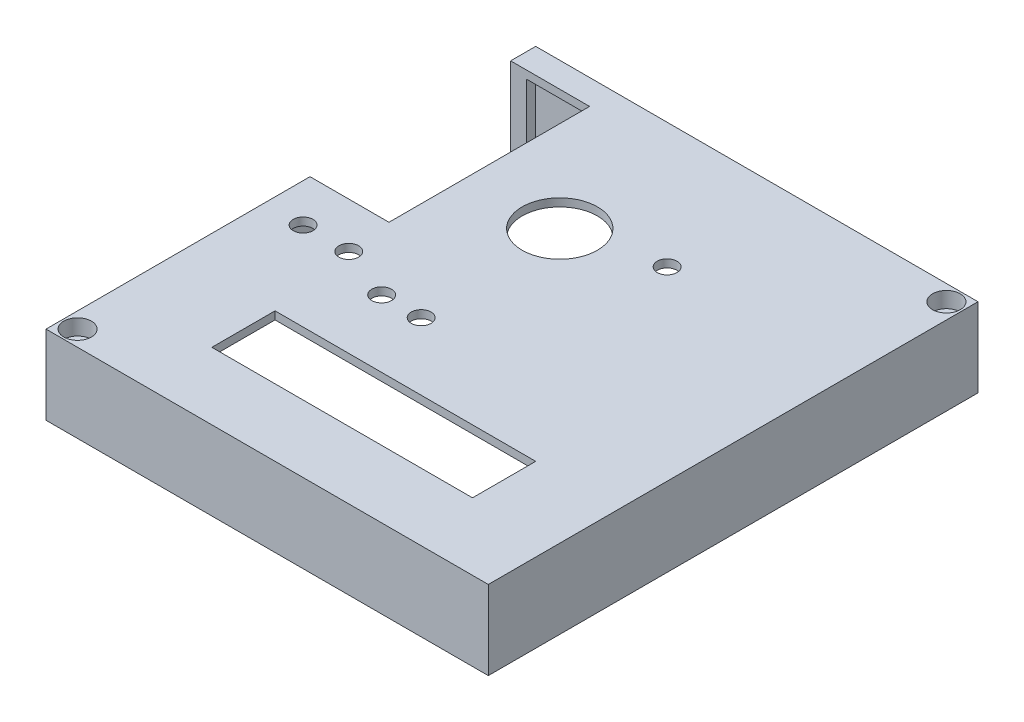
ISO-10303-21;
HEADER;
FILE_DESCRIPTION(('STEP AP214'),'2;1');
FILE_NAME('part.step','',(''),(''),'','','');
FILE_SCHEMA(('AUTOMOTIVE_DESIGN { 1 0 10303 214 1 1 1 1 }'));
ENDSEC;
DATA;
#1=APPLICATION_CONTEXT('core data for automotive mechanical design processes');
#2=APPLICATION_PROTOCOL_DEFINITION('international standard','automotive_design',2000,#1);
#3=PRODUCT_CONTEXT('',#1,'mechanical');
#4=PRODUCT('Part','Part','',(#3));
#5=PRODUCT_RELATED_PRODUCT_CATEGORY('part','',(#4));
#6=PRODUCT_DEFINITION_FORMATION('','',#4);
#7=PRODUCT_DEFINITION_CONTEXT('part definition',#1,'design');
#8=PRODUCT_DEFINITION('design','',#6,#7);
#9=PRODUCT_DEFINITION_SHAPE('','',#8);
#10=(LENGTH_UNIT() NAMED_UNIT(*) SI_UNIT(.MILLI.,.METRE.));
#11=(NAMED_UNIT(*) PLANE_ANGLE_UNIT() SI_UNIT($,.RADIAN.));
#12=(NAMED_UNIT(*) SI_UNIT($,.STERADIAN.) SOLID_ANGLE_UNIT());
#13=UNCERTAINTY_MEASURE_WITH_UNIT(LENGTH_MEASURE(1.E-05),#10,'distance_accuracy_value','');
#14=(GEOMETRIC_REPRESENTATION_CONTEXT(3) GLOBAL_UNCERTAINTY_ASSIGNED_CONTEXT((#13)) GLOBAL_UNIT_ASSIGNED_CONTEXT((#10,
#11,#12)) REPRESENTATION_CONTEXT('',''));
#15=CARTESIAN_POINT('',(0.,0.,0.));
#16=DIRECTION('',(0.,0.,1.));
#17=DIRECTION('',(1.,0.,0.));
#18=AXIS2_PLACEMENT_3D('',#15,#16,#17);
#19=CARTESIAN_POINT('',(-56.,2.,62.));
#20=DIRECTION('',(1.,0.,0.));
#21=DIRECTION('',(0.,0.,-1.));
#22=AXIS2_PLACEMENT_3D('',#19,#20,#21);
#23=PLANE('',#22);
#24=DIRECTION('',(0.,0.,-1.));
#25=VECTOR('',#24,1.);
#26=CARTESIAN_POINT('',(-56.,-18.,62.));
#27=LINE('',#26,#25);
#28=CARTESIAN_POINT('',(-56.,-18.,-55.65));
#29=VERTEX_POINT('',#28);
#30=CARTESIAN_POINT('',(-56.,-18.,-62.));
#31=VERTEX_POINT('',#30);
#32=EDGE_CURVE('E375',#29,#31,#27,.T.);
#33=ORIENTED_EDGE('',*,*,#32,.F.);
#34=DIRECTION('',(0.,-1.,0.));
#35=VECTOR('',#34,1.);
#36=CARTESIAN_POINT('',(-56.,2.,-55.65));
#37=LINE('',#36,#35);
#38=CARTESIAN_POINT('',(-56.,2.,-55.65));
#39=VERTEX_POINT('',#38);
#40=EDGE_CURVE('E210',#39,#29,#37,.T.);
#41=ORIENTED_EDGE('',*,*,#40,.F.);
#42=DIRECTION('',(0.,0.,1.));
#43=VECTOR('',#42,1.);
#44=CARTESIAN_POINT('',(-56.,2.,62.));
#45=LINE('',#44,#43);
#46=CARTESIAN_POINT('',(-56.,2.,-62.));
#47=VERTEX_POINT('',#46);
#48=EDGE_CURVE('E385',#47,#39,#45,.T.);
#49=ORIENTED_EDGE('',*,*,#48,.F.);
#50=DIRECTION('',(0.,-1.,0.));
#51=VECTOR('',#50,1.);
#52=CARTESIAN_POINT('',(-56.,2.,-62.));
#53=LINE('',#52,#51);
#54=EDGE_CURVE('E393',#47,#31,#53,.T.);
#55=ORIENTED_EDGE('',*,*,#54,.T.);
#56=EDGE_LOOP('',(#33,#41,#49,#55));
#57=FACE_BOUND('',#56,.T.);
#58=ADVANCED_FACE('F33',(#57),#23,.F.);
#59=CARTESIAN_POINT('',(-52.,-18.,54.));
#60=DIRECTION('',(1.,0.,0.));
#61=DIRECTION('',(0.,0.,-1.));
#62=AXIS2_PLACEMENT_3D('',#59,#60,#61);
#63=PLANE('',#62);
#64=DIRECTION('',(0.,1.,0.));
#65=VECTOR('',#64,1.);
#66=CARTESIAN_POINT('',(-52.,-18.,-55.65));
#67=LINE('',#66,#65);
#68=CARTESIAN_POINT('',(-52.,-18.,-55.65));
#69=VERTEX_POINT('',#68);
#70=CARTESIAN_POINT('',(-52.,0.,-55.65));
#71=VERTEX_POINT('',#70);
#72=EDGE_CURVE('E217',#69,#71,#67,.T.);
#73=ORIENTED_EDGE('',*,*,#72,.F.);
#74=DIRECTION('',(0.,0.,-1.));
#75=VECTOR('',#74,1.);
#76=CARTESIAN_POINT('',(-52.,-18.,54.));
#77=LINE('',#76,#75);
#78=CARTESIAN_POINT('',(-52.,-18.,-58.));
#79=VERTEX_POINT('',#78);
#80=EDGE_CURVE('E313',#69,#79,#77,.T.);
#81=ORIENTED_EDGE('',*,*,#80,.T.);
#82=DIRECTION('',(0.,1.,0.));
#83=VECTOR('',#82,1.);
#84=CARTESIAN_POINT('',(-52.,-18.,-58.));
#85=LINE('',#84,#83);
#86=CARTESIAN_POINT('',(-52.,0.,-58.));
#87=VERTEX_POINT('',#86);
#88=EDGE_CURVE('E354',#79,#87,#85,.T.);
#89=ORIENTED_EDGE('',*,*,#88,.T.);
#90=DIRECTION('',(0.,0.,-1.));
#91=VECTOR('',#90,1.);
#92=CARTESIAN_POINT('',(-52.,0.,54.));
#93=LINE('',#92,#91);
#94=EDGE_CURVE('E332',#71,#87,#93,.T.);
#95=ORIENTED_EDGE('',*,*,#94,.F.);
#96=EDGE_LOOP('',(#73,#81,#89,#95));
#97=FACE_BOUND('',#96,.T.);
#98=ADVANCED_FACE('F452',(#97),#63,.T.);
#99=CARTESIAN_POINT('',(-52.,-18.,58.));
#100=DIRECTION('',(0.,1.,0.));
#101=DIRECTION('',(0.,0.,1.));
#102=AXIS2_PLACEMENT_3D('',#99,#100,#101);
#103=CYLINDRICAL_SURFACE('',#102,2.);
#104=CARTESIAN_POINT('',(-52.,-18.,58.));
#105=DIRECTION('',(0.,1.,0.));
#106=DIRECTION('',(0.,0.,1.));
#107=AXIS2_PLACEMENT_3D('',#104,#105,#106);
#108=CIRCLE('',#107,2.);
#109=CARTESIAN_POINT('',(-52.,-18.,60.));
#110=VERTEX_POINT('',#109);
#111=EDGE_CURVE('E236',#110,#110,#108,.T.);
#112=ORIENTED_EDGE('',*,*,#111,.F.);
#113=EDGE_LOOP('',(#112));
#114=FACE_BOUND('',#113,.T.);
#115=CARTESIAN_POINT('',(-52.,-2.,58.));
#116=DIRECTION('',(0.,1.,0.));
#117=DIRECTION('',(0.,0.,1.));
#118=AXIS2_PLACEMENT_3D('',#115,#116,#117);
#119=CIRCLE('',#118,2.);
#120=CARTESIAN_POINT('',(-52.,-2.,60.));
#121=VERTEX_POINT('',#120);
#122=EDGE_CURVE('E239',#121,#121,#119,.F.);
#123=ORIENTED_EDGE('',*,*,#122,.F.);
#124=EDGE_LOOP('',(#123));
#125=FACE_BOUND('',#124,.T.);
#126=ADVANCED_FACE('F491',(#114,#125),#103,.F.);
#127=CARTESIAN_POINT('',(52.,-18.,-58.));
#128=DIRECTION('',(0.,1.,0.));
#129=DIRECTION('',(0.,0.,1.));
#130=AXIS2_PLACEMENT_3D('',#127,#128,#129);
#131=CYLINDRICAL_SURFACE('',#130,2.);
#132=CARTESIAN_POINT('',(52.,-18.,-58.));
#133=DIRECTION('',(0.,1.,0.));
#134=DIRECTION('',(0.,0.,1.));
#135=AXIS2_PLACEMENT_3D('',#132,#133,#134);
#136=CIRCLE('',#135,2.);
#137=CARTESIAN_POINT('',(52.,-18.,-56.));
#138=VERTEX_POINT('',#137);
#139=EDGE_CURVE('E232',#138,#138,#136,.T.);
#140=ORIENTED_EDGE('',*,*,#139,.F.);
#141=EDGE_LOOP('',(#140));
#142=FACE_BOUND('',#141,.T.);
#143=CARTESIAN_POINT('',(52.,-2.,-58.));
#144=DIRECTION('',(0.,1.,0.));
#145=DIRECTION('',(0.,0.,1.));
#146=AXIS2_PLACEMENT_3D('',#143,#144,#145);
#147=CIRCLE('',#146,2.);
#148=CARTESIAN_POINT('',(52.,-2.,-56.));
#149=VERTEX_POINT('',#148);
#150=EDGE_CURVE('E223',#149,#149,#147,.F.);
#151=ORIENTED_EDGE('',*,*,#150,.F.);
#152=EDGE_LOOP('',(#151));
#153=FACE_BOUND('',#152,.T.);
#154=ADVANCED_FACE('F502',(#142,#153),#131,.F.);
#155=CARTESIAN_POINT('',(56.,2.,62.));
#156=DIRECTION('',(-1.,0.,0.));
#157=DIRECTION('',(0.,0.,1.));
#158=AXIS2_PLACEMENT_3D('',#155,#156,#157);
#159=PLANE('',#158);
#160=DIRECTION('',(0.,-1.,0.));
#161=VECTOR('',#160,1.);
#162=CARTESIAN_POINT('',(56.,2.,62.));
#163=LINE('',#162,#161);
#164=CARTESIAN_POINT('',(56.,2.,62.));
#165=VERTEX_POINT('',#164);
#166=CARTESIAN_POINT('',(56.,-18.,62.));
#167=VERTEX_POINT('',#166);
#168=EDGE_CURVE('E389',#165,#167,#163,.T.);
#169=ORIENTED_EDGE('',*,*,#168,.T.);
#170=DIRECTION('',(0.,0.,1.));
#171=VECTOR('',#170,1.);
#172=CARTESIAN_POINT('',(56.,-18.,-62.));
#173=LINE('',#172,#171);
#174=CARTESIAN_POINT('',(56.,-18.,-62.));
#175=VERTEX_POINT('',#174);
#176=EDGE_CURVE('E369',#175,#167,#173,.T.);
#177=ORIENTED_EDGE('',*,*,#176,.F.);
#178=DIRECTION('',(0.,-1.,0.));
#179=VECTOR('',#178,1.);
#180=CARTESIAN_POINT('',(56.,2.,-62.));
#181=LINE('',#180,#179);
#182=CARTESIAN_POINT('',(56.,2.,-62.));
#183=VERTEX_POINT('',#182);
#184=EDGE_CURVE('E396',#183,#175,#181,.T.);
#185=ORIENTED_EDGE('',*,*,#184,.F.);
#186=DIRECTION('',(0.,0.,-1.));
#187=VECTOR('',#186,1.);
#188=CARTESIAN_POINT('',(56.,2.,62.));
#189=LINE('',#188,#187);
#190=EDGE_CURVE('E379',#165,#183,#189,.T.);
#191=ORIENTED_EDGE('',*,*,#190,.F.);
#192=EDGE_LOOP('',(#169,#177,#185,#191));
#193=FACE_BOUND('',#192,.T.);
#194=ADVANCED_FACE('F35',(#193),#159,.F.);
#195=CARTESIAN_POINT('',(-56.,2.,-62.));
#196=DIRECTION('',(0.,0.,1.));
#197=DIRECTION('',(1.,0.,0.));
#198=AXIS2_PLACEMENT_3D('',#195,#196,#197);
#199=PLANE('',#198);
#200=ORIENTED_EDGE('',*,*,#184,.T.);
#201=DIRECTION('',(1.,0.,0.));
#202=VECTOR('',#201,1.);
#203=CARTESIAN_POINT('',(-56.,-18.,-62.));
#204=LINE('',#203,#202);
#205=EDGE_CURVE('E366',#31,#175,#204,.T.);
#206=ORIENTED_EDGE('',*,*,#205,.F.);
#207=ORIENTED_EDGE('',*,*,#54,.F.);
#208=DIRECTION('',(-1.,0.,0.));
#209=VECTOR('',#208,1.);
#210=CARTESIAN_POINT('',(-56.,2.,-62.));
#211=LINE('',#210,#209);
#212=EDGE_CURVE('E382',#183,#47,#211,.T.);
#213=ORIENTED_EDGE('',*,*,#212,.F.);
#214=EDGE_LOOP('',(#200,#206,#207,#213));
#215=FACE_BOUND('',#214,.T.);
#216=ADVANCED_FACE('F438',(#215),#199,.F.);
#217=CARTESIAN_POINT('',(-56.,2.,-4.85));
#218=VERTEX_POINT('',#217);
#219=CARTESIAN_POINT('',(-56.,2.,62.));
#220=VERTEX_POINT('',#219);
#221=EDGE_CURVE('E384',#218,#220,#45,.T.);
#222=ORIENTED_EDGE('',*,*,#221,.F.);
#223=DIRECTION('',(0.,1.,0.));
#224=VECTOR('',#223,1.);
#225=CARTESIAN_POINT('',(-56.,2.,-4.85));
#226=LINE('',#225,#224);
#227=CARTESIAN_POINT('',(-56.,-18.,-4.85));
#228=VERTEX_POINT('',#227);
#229=EDGE_CURVE('E195',#228,#218,#226,.T.);
#230=ORIENTED_EDGE('',*,*,#229,.F.);
#231=CARTESIAN_POINT('',(-56.,-18.,62.));
#232=VERTEX_POINT('',#231);
#233=EDGE_CURVE('E376',#232,#228,#27,.T.);
#234=ORIENTED_EDGE('',*,*,#233,.F.);
#235=DIRECTION('',(0.,-1.,0.));
#236=VECTOR('',#235,1.);
#237=CARTESIAN_POINT('',(-56.,2.,62.));
#238=LINE('',#237,#236);
#239=EDGE_CURVE('E391',#220,#232,#238,.T.);
#240=ORIENTED_EDGE('',*,*,#239,.F.);
#241=EDGE_LOOP('',(#222,#230,#234,#240));
#242=FACE_BOUND('',#241,.T.);
#243=ADVANCED_FACE('F425',(#242),#23,.F.);
#244=CARTESIAN_POINT('',(-56.,2.,62.));
#245=DIRECTION('',(0.,0.,-1.));
#246=DIRECTION('',(-1.,0.,0.));
#247=AXIS2_PLACEMENT_3D('',#244,#245,#246);
#248=PLANE('',#247);
#249=ORIENTED_EDGE('',*,*,#239,.T.);
#250=DIRECTION('',(-1.,0.,0.));
#251=VECTOR('',#250,1.);
#252=CARTESIAN_POINT('',(56.,-18.,62.));
#253=LINE('',#252,#251);
#254=EDGE_CURVE('E372',#167,#232,#253,.T.);
#255=ORIENTED_EDGE('',*,*,#254,.F.);
#256=ORIENTED_EDGE('',*,*,#168,.F.);
#257=DIRECTION('',(1.,0.,0.));
#258=VECTOR('',#257,1.);
#259=CARTESIAN_POINT('',(-56.,2.,62.));
#260=LINE('',#259,#258);
#261=EDGE_CURVE('E387',#220,#165,#260,.T.);
#262=ORIENTED_EDGE('',*,*,#261,.F.);
#263=EDGE_LOOP('',(#249,#255,#256,#262));
#264=FACE_BOUND('',#263,.T.);
#265=ADVANCED_FACE('F433',(#264),#248,.F.);
#266=CARTESIAN_POINT('',(0.,2.,0.));
#267=DIRECTION('',(0.,-1.,0.));
#268=DIRECTION('',(0.,0.,-1.));
#269=AXIS2_PLACEMENT_3D('',#266,#267,#268);
#270=PLANE('',#269);
#271=ORIENTED_EDGE('',*,*,#48,.T.);
#272=DIRECTION('',(-1.,0.,0.));
#273=VECTOR('',#272,1.);
#274=CARTESIAN_POINT('',(-36.,2.,-55.65));
#275=LINE('',#274,#273);
#276=CARTESIAN_POINT('',(-36.,2.,-55.65));
#277=VERTEX_POINT('',#276);
#278=EDGE_CURVE('E198',#277,#39,#275,.T.);
#279=ORIENTED_EDGE('',*,*,#278,.F.);
#280=DIRECTION('',(0.,0.,-1.));
#281=VECTOR('',#280,1.);
#282=CARTESIAN_POINT('',(-36.,2.,-55.65));
#283=LINE('',#282,#281);
#284=CARTESIAN_POINT('',(-36.,2.,-4.85));
#285=VERTEX_POINT('',#284);
#286=EDGE_CURVE('E184',#285,#277,#283,.T.);
#287=ORIENTED_EDGE('',*,*,#286,.F.);
#288=DIRECTION('',(-1.,0.,0.));
#289=VECTOR('',#288,1.);
#290=CARTESIAN_POINT('',(-36.,2.,-4.85));
#291=LINE('',#290,#289);
#292=EDGE_CURVE('E192',#285,#218,#291,.T.);
#293=ORIENTED_EDGE('',*,*,#292,.T.);
#294=ORIENTED_EDGE('',*,*,#221,.T.);
#295=ORIENTED_EDGE('',*,*,#261,.T.);
#296=ORIENTED_EDGE('',*,*,#190,.T.);
#297=ORIENTED_EDGE('',*,*,#212,.T.);
#298=EDGE_LOOP('',(#271,#279,#287,#293,#294,#295,#296,#297));
#299=FACE_BOUND('',#298,.T.);
#300=CARTESIAN_POINT('',(-52.,2.,58.));
#301=DIRECTION('',(0.,1.,0.));
#302=DIRECTION('',(0.,0.,1.));
#303=AXIS2_PLACEMENT_3D('',#300,#301,#302);
#304=CIRCLE('',#303,3.5);
#305=CARTESIAN_POINT('',(-52.,2.,61.5));
#306=VERTEX_POINT('',#305);
#307=EDGE_CURVE('E224',#306,#306,#304,.T.);
#308=ORIENTED_EDGE('',*,*,#307,.F.);
#309=EDGE_LOOP('',(#308));
#310=FACE_BOUND('',#309,.T.);
#311=CARTESIAN_POINT('',(52.,2.,-58.));
#312=DIRECTION('',(0.,1.,0.));
#313=DIRECTION('',(0.,0.,1.));
#314=AXIS2_PLACEMENT_3D('',#311,#312,#313);
#315=CIRCLE('',#314,3.5);
#316=CARTESIAN_POINT('',(52.,2.,-54.5));
#317=VERTEX_POINT('',#316);
#318=EDGE_CURVE('E219',#317,#317,#315,.T.);
#319=ORIENTED_EDGE('',*,*,#318,.F.);
#320=EDGE_LOOP('',(#319));
#321=FACE_BOUND('',#320,.T.);
#322=DIRECTION('',(-1.,0.,0.));
#323=VECTOR('',#322,1.);
#324=CARTESIAN_POINT('',(-31.,2.,29.));
#325=LINE('',#324,#323);
#326=CARTESIAN_POINT('',(35.,2.,29.));
#327=VERTEX_POINT('',#326);
#328=CARTESIAN_POINT('',(-31.,2.,29.));
#329=VERTEX_POINT('',#328);
#330=EDGE_CURVE('E251',#327,#329,#325,.T.);
#331=ORIENTED_EDGE('',*,*,#330,.F.);
#332=DIRECTION('',(0.,0.,-1.));
#333=VECTOR('',#332,1.);
#334=CARTESIAN_POINT('',(35.,2.,45.));
#335=LINE('',#334,#333);
#336=CARTESIAN_POINT('',(35.,2.,45.));
#337=VERTEX_POINT('',#336);
#338=EDGE_CURVE('E55',#337,#327,#335,.T.);
#339=ORIENTED_EDGE('',*,*,#338,.F.);
#340=DIRECTION('',(1.,0.,0.));
#341=VECTOR('',#340,1.);
#342=CARTESIAN_POINT('',(-31.,2.,45.));
#343=LINE('',#342,#341);
#344=CARTESIAN_POINT('',(-31.,2.,45.));
#345=VERTEX_POINT('',#344);
#346=EDGE_CURVE('E257',#345,#337,#343,.T.);
#347=ORIENTED_EDGE('',*,*,#346,.F.);
#348=DIRECTION('',(0.,0.,1.));
#349=VECTOR('',#348,1.);
#350=CARTESIAN_POINT('',(-31.,2.,45.));
#351=LINE('',#350,#349);
#352=EDGE_CURVE('E254',#329,#345,#351,.T.);
#353=ORIENTED_EDGE('',*,*,#352,.F.);
#354=EDGE_LOOP('',(#331,#339,#347,#353));
#355=FACE_BOUND('',#354,.T.);
#356=CARTESIAN_POINT('',(9.,2.,-30.28));
#357=DIRECTION('',(0.,1.,0.));
#358=DIRECTION('',(0.,0.,1.));
#359=AXIS2_PLACEMENT_3D('',#356,#357,#358);
#360=CIRCLE('',#359,2.5);
#361=CARTESIAN_POINT('',(9.,2.,-27.78));
#362=VERTEX_POINT('',#361);
#363=EDGE_CURVE('E279',#362,#362,#360,.T.);
#364=ORIENTED_EDGE('',*,*,#363,.F.);
#365=EDGE_LOOP('',(#364));
#366=FACE_BOUND('',#365,.T.);
#367=CARTESIAN_POINT('',(-11.,2.,12.));
#368=DIRECTION('',(0.,1.,0.));
#369=DIRECTION('',(0.,0.,1.));
#370=AXIS2_PLACEMENT_3D('',#367,#368,#369);
#371=CIRCLE('',#370,2.5);
#372=CARTESIAN_POINT('',(-11.,2.,14.5));
#373=VERTEX_POINT('',#372);
#374=EDGE_CURVE('E272',#373,#373,#371,.T.);
#375=ORIENTED_EDGE('',*,*,#374,.F.);
#376=EDGE_LOOP('',(#375));
#377=FACE_BOUND('',#376,.T.);
#378=CARTESIAN_POINT('',(-13.,2.,-25.1));
#379=DIRECTION('',(0.,1.,0.));
#380=DIRECTION('',(0.,0.,1.));
#381=AXIS2_PLACEMENT_3D('',#378,#379,#380);
#382=CIRCLE('',#381,9.525);
#383=CARTESIAN_POINT('',(-13.,2.,-15.575));
#384=VERTEX_POINT('',#383);
#385=EDGE_CURVE('E244',#384,#384,#382,.T.);
#386=ORIENTED_EDGE('',*,*,#385,.F.);
#387=EDGE_LOOP('',(#386));
#388=FACE_BOUND('',#387,.T.);
#389=CARTESIAN_POINT('',(-46.27,2.,6.63));
#390=DIRECTION('',(0.,1.,0.));
#391=DIRECTION('',(0.,0.,1.));
#392=AXIS2_PLACEMENT_3D('',#389,#390,#391);
#393=CIRCLE('',#392,2.5);
#394=CARTESIAN_POINT('',(-46.27,2.,9.13000000000001));
#395=VERTEX_POINT('',#394);
#396=EDGE_CURVE('E301',#395,#395,#393,.T.);
#397=ORIENTED_EDGE('',*,*,#396,.F.);
#398=EDGE_LOOP('',(#397));
#399=FACE_BOUND('',#398,.T.);
#400=CARTESIAN_POINT('',(-34.7,2.,6.63));
#401=DIRECTION('',(0.,1.,0.));
#402=DIRECTION('',(0.,0.,1.));
#403=AXIS2_PLACEMENT_3D('',#400,#401,#402);
#404=CIRCLE('',#403,2.5);
#405=CARTESIAN_POINT('',(-34.7,2.,9.13000000000001));
#406=VERTEX_POINT('',#405);
#407=EDGE_CURVE('E284',#406,#406,#404,.T.);
#408=ORIENTED_EDGE('',*,*,#407,.F.);
#409=EDGE_LOOP('',(#408));
#410=FACE_BOUND('',#409,.T.);
#411=CARTESIAN_POINT('',(-21.,2.,12.));
#412=DIRECTION('',(0.,1.,0.));
#413=DIRECTION('',(0.,0.,1.));
#414=AXIS2_PLACEMENT_3D('',#411,#412,#413);
#415=CIRCLE('',#414,2.5);
#416=CARTESIAN_POINT('',(-21.,2.,14.5));
#417=VERTEX_POINT('',#416);
#418=EDGE_CURVE('E291',#417,#417,#415,.T.);
#419=ORIENTED_EDGE('',*,*,#418,.F.);
#420=EDGE_LOOP('',(#419));
#421=FACE_BOUND('',#420,.T.);
#422=ADVANCED_FACE('F202',(#299,#310,#321,#355,#366,#377,#388,#399,#410,#421),#270,.F.);
#423=CARTESIAN_POINT('',(0.,-18.,0.));
#424=DIRECTION('',(0.,-1.,0.));
#425=DIRECTION('',(0.,0.,-1.));
#426=AXIS2_PLACEMENT_3D('',#423,#424,#425);
#427=PLANE('',#426);
#428=DIRECTION('',(-1.,0.,0.));
#429=VECTOR('',#428,1.);
#430=CARTESIAN_POINT('',(-36.,-18.,-55.65));
#431=LINE('',#430,#429);
#432=EDGE_CURVE('E204',#69,#29,#431,.T.);
#433=ORIENTED_EDGE('',*,*,#432,.T.);
#434=ORIENTED_EDGE('',*,*,#32,.T.);
#435=ORIENTED_EDGE('',*,*,#205,.T.);
#436=ORIENTED_EDGE('',*,*,#176,.T.);
#437=ORIENTED_EDGE('',*,*,#254,.T.);
#438=ORIENTED_EDGE('',*,*,#233,.T.);
#439=DIRECTION('',(-1.,0.,0.));
#440=VECTOR('',#439,1.);
#441=CARTESIAN_POINT('',(-36.,-18.,-4.85));
#442=LINE('',#441,#440);
#443=CARTESIAN_POINT('',(-52.,-18.,-4.85));
#444=VERTEX_POINT('',#443);
#445=EDGE_CURVE('E199',#444,#228,#442,.T.);
#446=ORIENTED_EDGE('',*,*,#445,.F.);
#447=CARTESIAN_POINT('',(-52.,-18.,54.));
#448=VERTEX_POINT('',#447);
#449=EDGE_CURVE('E314',#448,#444,#77,.T.);
#450=ORIENTED_EDGE('',*,*,#449,.F.);
#451=DIRECTION('',(-1.,0.,0.));
#452=VECTOR('',#451,1.);
#453=CARTESIAN_POINT('',(-48.,-18.,54.));
#454=LINE('',#453,#452);
#455=CARTESIAN_POINT('',(-48.,-18.,54.));
#456=VERTEX_POINT('',#455);
#457=EDGE_CURVE('E311',#456,#448,#454,.T.);
#458=ORIENTED_EDGE('',*,*,#457,.F.);
#459=DIRECTION('',(0.,0.,-1.));
#460=VECTOR('',#459,1.);
#461=CARTESIAN_POINT('',(-48.,-18.,58.));
#462=LINE('',#461,#460);
#463=CARTESIAN_POINT('',(-48.,-18.,58.));
#464=VERTEX_POINT('',#463);
#465=EDGE_CURVE('E308',#464,#456,#462,.T.);
#466=ORIENTED_EDGE('',*,*,#465,.F.);
#467=DIRECTION('',(-1.,0.,0.));
#468=VECTOR('',#467,1.);
#469=CARTESIAN_POINT('',(52.,-18.,58.));
#470=LINE('',#469,#468);
#471=CARTESIAN_POINT('',(52.,-18.,58.));
#472=VERTEX_POINT('',#471);
#473=EDGE_CURVE('E306',#472,#464,#470,.T.);
#474=ORIENTED_EDGE('',*,*,#473,.F.);
#475=DIRECTION('',(0.,0.,1.));
#476=VECTOR('',#475,1.);
#477=CARTESIAN_POINT('',(52.,-18.,-54.));
#478=LINE('',#477,#476);
#479=CARTESIAN_POINT('',(52.,-18.,-54.));
#480=VERTEX_POINT('',#479);
#481=EDGE_CURVE('E324',#480,#472,#478,.T.);
#482=ORIENTED_EDGE('',*,*,#481,.F.);
#483=DIRECTION('',(1.,0.,0.));
#484=VECTOR('',#483,1.);
#485=CARTESIAN_POINT('',(48.,-18.,-54.));
#486=LINE('',#485,#484);
#487=CARTESIAN_POINT('',(48.,-18.,-54.));
#488=VERTEX_POINT('',#487);
#489=EDGE_CURVE('E321',#488,#480,#486,.T.);
#490=ORIENTED_EDGE('',*,*,#489,.F.);
#491=DIRECTION('',(0.,0.,1.));
#492=VECTOR('',#491,1.);
#493=CARTESIAN_POINT('',(48.,-18.,-58.));
#494=LINE('',#493,#492);
#495=CARTESIAN_POINT('',(48.,-18.,-58.));
#496=VERTEX_POINT('',#495);
#497=EDGE_CURVE('E319',#496,#488,#494,.T.);
#498=ORIENTED_EDGE('',*,*,#497,.F.);
#499=DIRECTION('',(1.,0.,0.));
#500=VECTOR('',#499,1.);
#501=CARTESIAN_POINT('',(-52.,-18.,-58.));
#502=LINE('',#501,#500);
#503=EDGE_CURVE('E317',#79,#496,#502,.T.);
#504=ORIENTED_EDGE('',*,*,#503,.F.);
#505=ORIENTED_EDGE('',*,*,#80,.F.);
#506=EDGE_LOOP('',(#433,#434,#435,#436,#437,#438,#446,#450,#458,#466,#474,#482,#490,#498,#504,#505));
#507=FACE_BOUND('',#506,.T.);
#508=ORIENTED_EDGE('',*,*,#139,.T.);
#509=EDGE_LOOP('',(#508));
#510=FACE_BOUND('',#509,.T.);
#511=ORIENTED_EDGE('',*,*,#111,.T.);
#512=EDGE_LOOP('',(#511));
#513=FACE_BOUND('',#512,.T.);
#514=ADVANCED_FACE('F420',(#507,#510,#513),#427,.T.);
#515=CARTESIAN_POINT('',(52.,-18.,58.));
#516=DIRECTION('',(0.,0.,-1.));
#517=DIRECTION('',(-1.,0.,0.));
#518=AXIS2_PLACEMENT_3D('',#515,#516,#517);
#519=PLANE('',#518);
#520=DIRECTION('',(-1.,0.,0.));
#521=VECTOR('',#520,1.);
#522=CARTESIAN_POINT('',(52.,0.,58.));
#523=LINE('',#522,#521);
#524=CARTESIAN_POINT('',(52.,0.,58.));
#525=VERTEX_POINT('',#524);
#526=CARTESIAN_POINT('',(-48.,0.,58.));
#527=VERTEX_POINT('',#526);
#528=EDGE_CURVE('E271',#525,#527,#523,.T.);
#529=ORIENTED_EDGE('',*,*,#528,.F.);
#530=DIRECTION('',(0.,1.,0.));
#531=VECTOR('',#530,1.);
#532=CARTESIAN_POINT('',(52.,-18.,58.));
#533=LINE('',#532,#531);
#534=EDGE_CURVE('E326',#472,#525,#533,.T.);
#535=ORIENTED_EDGE('',*,*,#534,.F.);
#536=ORIENTED_EDGE('',*,*,#473,.T.);
#537=DIRECTION('',(0.,1.,0.));
#538=VECTOR('',#537,1.);
#539=CARTESIAN_POINT('',(-48.,-18.,58.));
#540=LINE('',#539,#538);
#541=EDGE_CURVE('E363',#464,#527,#540,.T.);
#542=ORIENTED_EDGE('',*,*,#541,.T.);
#543=EDGE_LOOP('',(#529,#535,#536,#542));
#544=FACE_BOUND('',#543,.T.);
#545=ADVANCED_FACE('F473',(#544),#519,.T.);
#546=CARTESIAN_POINT('',(-48.,-18.,58.));
#547=DIRECTION('',(1.,0.,0.));
#548=DIRECTION('',(0.,0.,-1.));
#549=AXIS2_PLACEMENT_3D('',#546,#547,#548);
#550=PLANE('',#549);
#551=DIRECTION('',(0.,0.,-1.));
#552=VECTOR('',#551,1.);
#553=CARTESIAN_POINT('',(-48.,0.,58.));
#554=LINE('',#553,#552);
#555=CARTESIAN_POINT('',(-48.,0.,54.));
#556=VERTEX_POINT('',#555);
#557=EDGE_CURVE('E328',#527,#556,#554,.T.);
#558=ORIENTED_EDGE('',*,*,#557,.F.);
#559=ORIENTED_EDGE('',*,*,#541,.F.);
#560=ORIENTED_EDGE('',*,*,#465,.T.);
#561=DIRECTION('',(0.,1.,0.));
#562=VECTOR('',#561,1.);
#563=CARTESIAN_POINT('',(-48.,-18.,54.));
#564=LINE('',#563,#562);
#565=EDGE_CURVE('E360',#456,#556,#564,.T.);
#566=ORIENTED_EDGE('',*,*,#565,.T.);
#567=EDGE_LOOP('',(#558,#559,#560,#566));
#568=FACE_BOUND('',#567,.T.);
#569=ADVANCED_FACE('F477',(#568),#550,.T.);
#570=CARTESIAN_POINT('',(-48.,-18.,54.));
#571=DIRECTION('',(0.,0.,-1.));
#572=DIRECTION('',(-1.,0.,0.));
#573=AXIS2_PLACEMENT_3D('',#570,#571,#572);
#574=PLANE('',#573);
#575=DIRECTION('',(-1.,0.,0.));
#576=VECTOR('',#575,1.);
#577=CARTESIAN_POINT('',(-48.,0.,54.));
#578=LINE('',#577,#576);
#579=CARTESIAN_POINT('',(-52.,0.,54.));
#580=VERTEX_POINT('',#579);
#581=EDGE_CURVE('E330',#556,#580,#578,.T.);
#582=ORIENTED_EDGE('',*,*,#581,.F.);
#583=ORIENTED_EDGE('',*,*,#565,.F.);
#584=ORIENTED_EDGE('',*,*,#457,.T.);
#585=DIRECTION('',(0.,1.,0.));
#586=VECTOR('',#585,1.);
#587=CARTESIAN_POINT('',(-52.,-18.,54.));
#588=LINE('',#587,#586);
#589=EDGE_CURVE('E357',#448,#580,#588,.T.);
#590=ORIENTED_EDGE('',*,*,#589,.T.);
#591=EDGE_LOOP('',(#582,#583,#584,#590));
#592=FACE_BOUND('',#591,.T.);
#593=ADVANCED_FACE('F417',(#592),#574,.T.);
#594=DIRECTION('',(0.,-1.,0.));
#595=VECTOR('',#594,1.);
#596=CARTESIAN_POINT('',(-52.,-18.,-4.85));
#597=LINE('',#596,#595);
#598=CARTESIAN_POINT('',(-52.,0.,-4.85));
#599=VERTEX_POINT('',#598);
#600=EDGE_CURVE('E213',#599,#444,#597,.T.);
#601=ORIENTED_EDGE('',*,*,#600,.F.);
#602=EDGE_CURVE('E333',#580,#599,#93,.T.);
#603=ORIENTED_EDGE('',*,*,#602,.F.);
#604=ORIENTED_EDGE('',*,*,#589,.F.);
#605=ORIENTED_EDGE('',*,*,#449,.T.);
#606=EDGE_LOOP('',(#601,#603,#604,#605));
#607=FACE_BOUND('',#606,.T.);
#608=ADVANCED_FACE('F407',(#607),#63,.T.);
#609=CARTESIAN_POINT('',(-52.,-18.,-58.));
#610=DIRECTION('',(0.,0.,1.));
#611=DIRECTION('',(1.,0.,0.));
#612=AXIS2_PLACEMENT_3D('',#609,#610,#611);
#613=PLANE('',#612);
#614=DIRECTION('',(1.,0.,0.));
#615=VECTOR('',#614,1.);
#616=CARTESIAN_POINT('',(-52.,0.,-58.));
#617=LINE('',#616,#615);
#618=CARTESIAN_POINT('',(48.,0.,-58.));
#619=VERTEX_POINT('',#618);
#620=EDGE_CURVE('E336',#87,#619,#617,.T.);
#621=ORIENTED_EDGE('',*,*,#620,.F.);
#622=ORIENTED_EDGE('',*,*,#88,.F.);
#623=ORIENTED_EDGE('',*,*,#503,.T.);
#624=DIRECTION('',(0.,1.,0.));
#625=VECTOR('',#624,1.);
#626=CARTESIAN_POINT('',(48.,-18.,-58.));
#627=LINE('',#626,#625);
#628=EDGE_CURVE('E351',#496,#619,#627,.T.);
#629=ORIENTED_EDGE('',*,*,#628,.T.);
#630=EDGE_LOOP('',(#621,#622,#623,#629));
#631=FACE_BOUND('',#630,.T.);
#632=ADVANCED_FACE('F456',(#631),#613,.T.);
#633=CARTESIAN_POINT('',(48.,-18.,-58.));
#634=DIRECTION('',(-1.,0.,0.));
#635=DIRECTION('',(0.,0.,1.));
#636=AXIS2_PLACEMENT_3D('',#633,#634,#635);
#637=PLANE('',#636);
#638=DIRECTION('',(0.,0.,1.));
#639=VECTOR('',#638,1.);
#640=CARTESIAN_POINT('',(48.,0.,-58.));
#641=LINE('',#640,#639);
#642=CARTESIAN_POINT('',(48.,0.,-54.));
#643=VERTEX_POINT('',#642);
#644=EDGE_CURVE('E338',#619,#643,#641,.T.);
#645=ORIENTED_EDGE('',*,*,#644,.F.);
#646=ORIENTED_EDGE('',*,*,#628,.F.);
#647=ORIENTED_EDGE('',*,*,#497,.T.);
#648=DIRECTION('',(0.,1.,0.));
#649=VECTOR('',#648,1.);
#650=CARTESIAN_POINT('',(48.,-18.,-54.));
#651=LINE('',#650,#649);
#652=EDGE_CURVE('E348',#488,#643,#651,.T.);
#653=ORIENTED_EDGE('',*,*,#652,.T.);
#654=EDGE_LOOP('',(#645,#646,#647,#653));
#655=FACE_BOUND('',#654,.T.);
#656=ADVANCED_FACE('F462',(#655),#637,.T.);
#657=CARTESIAN_POINT('',(48.,-18.,-54.));
#658=DIRECTION('',(0.,0.,1.));
#659=DIRECTION('',(1.,0.,0.));
#660=AXIS2_PLACEMENT_3D('',#657,#658,#659);
#661=PLANE('',#660);
#662=DIRECTION('',(1.,0.,0.));
#663=VECTOR('',#662,1.);
#664=CARTESIAN_POINT('',(48.,0.,-54.));
#665=LINE('',#664,#663);
#666=CARTESIAN_POINT('',(52.,0.,-54.));
#667=VERTEX_POINT('',#666);
#668=EDGE_CURVE('E340',#643,#667,#665,.T.);
#669=ORIENTED_EDGE('',*,*,#668,.F.);
#670=ORIENTED_EDGE('',*,*,#652,.F.);
#671=ORIENTED_EDGE('',*,*,#489,.T.);
#672=DIRECTION('',(0.,1.,0.));
#673=VECTOR('',#672,1.);
#674=CARTESIAN_POINT('',(52.,-18.,-54.));
#675=LINE('',#674,#673);
#676=EDGE_CURVE('E345',#480,#667,#675,.T.);
#677=ORIENTED_EDGE('',*,*,#676,.T.);
#678=EDGE_LOOP('',(#669,#670,#671,#677));
#679=FACE_BOUND('',#678,.T.);
#680=ADVANCED_FACE('F465',(#679),#661,.T.);
#681=CARTESIAN_POINT('',(52.,-18.,-54.));
#682=DIRECTION('',(-1.,0.,0.));
#683=DIRECTION('',(0.,0.,1.));
#684=AXIS2_PLACEMENT_3D('',#681,#682,#683);
#685=PLANE('',#684);
#686=DIRECTION('',(0.,0.,1.));
#687=VECTOR('',#686,1.);
#688=CARTESIAN_POINT('',(52.,0.,-54.));
#689=LINE('',#688,#687);
#690=EDGE_CURVE('E309',#667,#525,#689,.T.);
#691=ORIENTED_EDGE('',*,*,#690,.F.);
#692=ORIENTED_EDGE('',*,*,#676,.F.);
#693=ORIENTED_EDGE('',*,*,#481,.T.);
#694=ORIENTED_EDGE('',*,*,#534,.T.);
#695=EDGE_LOOP('',(#691,#692,#693,#694));
#696=FACE_BOUND('',#695,.T.);
#697=ADVANCED_FACE('F469',(#696),#685,.T.);
#698=CARTESIAN_POINT('',(0.,0.,0.));
#699=DIRECTION('',(0.,-1.,0.));
#700=DIRECTION('',(0.,0.,-1.));
#701=AXIS2_PLACEMENT_3D('',#698,#699,#700);
#702=PLANE('',#701);
#703=DIRECTION('',(1.,0.,0.));
#704=VECTOR('',#703,1.);
#705=CARTESIAN_POINT('',(0.,0.,-55.65));
#706=LINE('',#705,#704);
#707=CARTESIAN_POINT('',(-36.,0.,-55.65));
#708=VERTEX_POINT('',#707);
#709=EDGE_CURVE('E11',#71,#708,#706,.T.);
#710=ORIENTED_EDGE('',*,*,#709,.F.);
#711=ORIENTED_EDGE('',*,*,#94,.T.);
#712=ORIENTED_EDGE('',*,*,#620,.T.);
#713=ORIENTED_EDGE('',*,*,#644,.T.);
#714=ORIENTED_EDGE('',*,*,#668,.T.);
#715=ORIENTED_EDGE('',*,*,#690,.T.);
#716=ORIENTED_EDGE('',*,*,#528,.T.);
#717=ORIENTED_EDGE('',*,*,#557,.T.);
#718=ORIENTED_EDGE('',*,*,#581,.T.);
#719=ORIENTED_EDGE('',*,*,#602,.T.);
#720=DIRECTION('',(-1.,0.,0.));
#721=VECTOR('',#720,1.);
#722=CARTESIAN_POINT('',(0.,0.,-4.85));
#723=LINE('',#722,#721);
#724=CARTESIAN_POINT('',(-36.,0.,-4.85));
#725=VERTEX_POINT('',#724);
#726=EDGE_CURVE('E41',#725,#599,#723,.T.);
#727=ORIENTED_EDGE('',*,*,#726,.F.);
#728=DIRECTION('',(0.,0.,-1.));
#729=VECTOR('',#728,1.);
#730=CARTESIAN_POINT('',(-36.,0.,0.));
#731=LINE('',#730,#729);
#732=EDGE_CURVE('E187',#725,#708,#731,.T.);
#733=ORIENTED_EDGE('',*,*,#732,.T.);
#734=EDGE_LOOP('',(#710,#711,#712,#713,#714,#715,#716,#717,#718,#719,#727,#733));
#735=FACE_BOUND('',#734,.T.);
#736=DIRECTION('',(0.,0.,-1.));
#737=VECTOR('',#736,1.);
#738=CARTESIAN_POINT('',(35.,0.,45.));
#739=LINE('',#738,#737);
#740=CARTESIAN_POINT('',(35.,0.,45.));
#741=VERTEX_POINT('',#740);
#742=CARTESIAN_POINT('',(35.,0.,29.));
#743=VERTEX_POINT('',#742);
#744=EDGE_CURVE('E247',#741,#743,#739,.T.);
#745=ORIENTED_EDGE('',*,*,#744,.T.);
#746=DIRECTION('',(-1.,0.,0.));
#747=VECTOR('',#746,1.);
#748=CARTESIAN_POINT('',(-31.,0.,29.));
#749=LINE('',#748,#747);
#750=CARTESIAN_POINT('',(-31.,0.,29.));
#751=VERTEX_POINT('',#750);
#752=EDGE_CURVE('E263',#743,#751,#749,.T.);
#753=ORIENTED_EDGE('',*,*,#752,.T.);
#754=DIRECTION('',(0.,0.,1.));
#755=VECTOR('',#754,1.);
#756=CARTESIAN_POINT('',(-31.,0.,45.));
#757=LINE('',#756,#755);
#758=CARTESIAN_POINT('',(-31.,0.,45.));
#759=VERTEX_POINT('',#758);
#760=EDGE_CURVE('E240',#751,#759,#757,.T.);
#761=ORIENTED_EDGE('',*,*,#760,.T.);
#762=DIRECTION('',(1.,0.,0.));
#763=VECTOR('',#762,1.);
#764=CARTESIAN_POINT('',(-31.,0.,45.));
#765=LINE('',#764,#763);
#766=EDGE_CURVE('E243',#759,#741,#765,.T.);
#767=ORIENTED_EDGE('',*,*,#766,.T.);
#768=EDGE_LOOP('',(#745,#753,#761,#767));
#769=FACE_BOUND('',#768,.T.);
#770=CARTESIAN_POINT('',(9.,0.,-30.28));
#771=DIRECTION('',(0.,-1.,0.));
#772=DIRECTION('',(0.,0.,-1.));
#773=AXIS2_PLACEMENT_3D('',#770,#771,#772);
#774=CIRCLE('',#773,2.5);
#775=CARTESIAN_POINT('',(9.,0.,-32.78));
#776=VERTEX_POINT('',#775);
#777=EDGE_CURVE('E235',#776,#776,#774,.F.);
#778=ORIENTED_EDGE('',*,*,#777,.T.);
#779=EDGE_LOOP('',(#778));
#780=FACE_BOUND('',#779,.T.);
#781=CARTESIAN_POINT('',(-11.,0.,12.));
#782=DIRECTION('',(0.,-1.,0.));
#783=DIRECTION('',(0.,0.,-1.));
#784=AXIS2_PLACEMENT_3D('',#781,#782,#783);
#785=CIRCLE('',#784,2.5);
#786=CARTESIAN_POINT('',(-11.,0.,9.5));
#787=VERTEX_POINT('',#786);
#788=EDGE_CURVE('E276',#787,#787,#785,.F.);
#789=ORIENTED_EDGE('',*,*,#788,.T.);
#790=EDGE_LOOP('',(#789));
#791=FACE_BOUND('',#790,.T.);
#792=CARTESIAN_POINT('',(-13.,0.,-25.1));
#793=DIRECTION('',(0.,-1.,0.));
#794=DIRECTION('',(0.,0.,-1.));
#795=AXIS2_PLACEMENT_3D('',#792,#793,#794);
#796=CIRCLE('',#795,9.525);
#797=CARTESIAN_POINT('',(-13.,0.,-34.625));
#798=VERTEX_POINT('',#797);
#799=EDGE_CURVE('E298',#798,#798,#796,.F.);
#800=ORIENTED_EDGE('',*,*,#799,.T.);
#801=EDGE_LOOP('',(#800));
#802=FACE_BOUND('',#801,.T.);
#803=CARTESIAN_POINT('',(-46.27,0.,6.63));
#804=DIRECTION('',(0.,-1.,0.));
#805=DIRECTION('',(0.,0.,-1.));
#806=AXIS2_PLACEMENT_3D('',#803,#804,#805);
#807=CIRCLE('',#806,2.5);
#808=CARTESIAN_POINT('',(-46.27,0.,4.13));
#809=VERTEX_POINT('',#808);
#810=EDGE_CURVE('E287',#809,#809,#807,.F.);
#811=ORIENTED_EDGE('',*,*,#810,.T.);
#812=EDGE_LOOP('',(#811));
#813=FACE_BOUND('',#812,.T.);
#814=CARTESIAN_POINT('',(-34.7,0.,6.63));
#815=DIRECTION('',(0.,-1.,0.));
#816=DIRECTION('',(0.,0.,-1.));
#817=AXIS2_PLACEMENT_3D('',#814,#815,#816);
#818=CIRCLE('',#817,2.5);
#819=CARTESIAN_POINT('',(-34.7,0.,4.13));
#820=VERTEX_POINT('',#819);
#821=EDGE_CURVE('E288',#820,#820,#818,.F.);
#822=ORIENTED_EDGE('',*,*,#821,.T.);
#823=EDGE_LOOP('',(#822));
#824=FACE_BOUND('',#823,.T.);
#825=CARTESIAN_POINT('',(-21.,0.,12.));
#826=DIRECTION('',(0.,-1.,0.));
#827=DIRECTION('',(0.,0.,-1.));
#828=AXIS2_PLACEMENT_3D('',#825,#826,#827);
#829=CIRCLE('',#828,2.5);
#830=CARTESIAN_POINT('',(-21.,0.,9.49999999999999));
#831=VERTEX_POINT('',#830);
#832=EDGE_CURVE('E275',#831,#831,#829,.F.);
#833=ORIENTED_EDGE('',*,*,#832,.T.);
#834=EDGE_LOOP('',(#833));
#835=FACE_BOUND('',#834,.T.);
#836=ADVANCED_FACE('F411',(#735,#769,#780,#791,#802,#813,#824,#835),#702,.T.);
#837=CARTESIAN_POINT('',(-21.,-18.001,12.));
#838=DIRECTION('',(0.,1.,0.));
#839=DIRECTION('',(0.,0.,1.));
#840=AXIS2_PLACEMENT_3D('',#837,#838,#839);
#841=CYLINDRICAL_SURFACE('',#840,2.5);
#842=ORIENTED_EDGE('',*,*,#832,.F.);
#843=EDGE_LOOP('',(#842));
#844=FACE_BOUND('',#843,.T.);
#845=ORIENTED_EDGE('',*,*,#418,.T.);
#846=EDGE_LOOP('',(#845));
#847=FACE_BOUND('',#846,.T.);
#848=ADVANCED_FACE('F548',(#844,#847),#841,.F.);
#849=CARTESIAN_POINT('',(-34.7,-18.001,6.63));
#850=DIRECTION('',(0.,1.,0.));
#851=DIRECTION('',(0.,0.,1.));
#852=AXIS2_PLACEMENT_3D('',#849,#850,#851);
#853=CYLINDRICAL_SURFACE('',#852,2.5);
#854=ORIENTED_EDGE('',*,*,#821,.F.);
#855=EDGE_LOOP('',(#854));
#856=FACE_BOUND('',#855,.T.);
#857=ORIENTED_EDGE('',*,*,#407,.T.);
#858=EDGE_LOOP('',(#857));
#859=FACE_BOUND('',#858,.T.);
#860=ADVANCED_FACE('F544',(#856,#859),#853,.F.);
#861=CARTESIAN_POINT('',(-46.27,-18.001,6.63));
#862=DIRECTION('',(0.,1.,0.));
#863=DIRECTION('',(0.,0.,1.));
#864=AXIS2_PLACEMENT_3D('',#861,#862,#863);
#865=CYLINDRICAL_SURFACE('',#864,2.5);
#866=ORIENTED_EDGE('',*,*,#810,.F.);
#867=EDGE_LOOP('',(#866));
#868=FACE_BOUND('',#867,.T.);
#869=ORIENTED_EDGE('',*,*,#396,.T.);
#870=EDGE_LOOP('',(#869));
#871=FACE_BOUND('',#870,.T.);
#872=ADVANCED_FACE('F547',(#868,#871),#865,.F.);
#873=CARTESIAN_POINT('',(-13.,-18.001,-25.1));
#874=DIRECTION('',(0.,1.,0.));
#875=DIRECTION('',(0.,0.,1.));
#876=AXIS2_PLACEMENT_3D('',#873,#874,#875);
#877=CYLINDRICAL_SURFACE('',#876,9.525);
#878=ORIENTED_EDGE('',*,*,#799,.F.);
#879=EDGE_LOOP('',(#878));
#880=FACE_BOUND('',#879,.T.);
#881=ORIENTED_EDGE('',*,*,#385,.T.);
#882=EDGE_LOOP('',(#881));
#883=FACE_BOUND('',#882,.T.);
#884=ADVANCED_FACE('F539',(#880,#883),#877,.F.);
#885=CARTESIAN_POINT('',(-11.,-18.001,12.));
#886=DIRECTION('',(0.,1.,0.));
#887=DIRECTION('',(0.,0.,1.));
#888=AXIS2_PLACEMENT_3D('',#885,#886,#887);
#889=CYLINDRICAL_SURFACE('',#888,2.5);
#890=ORIENTED_EDGE('',*,*,#788,.F.);
#891=EDGE_LOOP('',(#890));
#892=FACE_BOUND('',#891,.T.);
#893=ORIENTED_EDGE('',*,*,#374,.T.);
#894=EDGE_LOOP('',(#893));
#895=FACE_BOUND('',#894,.T.);
#896=ADVANCED_FACE('F536',(#892,#895),#889,.F.);
#897=CARTESIAN_POINT('',(9.,-18.001,-30.28));
#898=DIRECTION('',(0.,1.,0.));
#899=DIRECTION('',(0.,0.,1.));
#900=AXIS2_PLACEMENT_3D('',#897,#898,#899);
#901=CYLINDRICAL_SURFACE('',#900,2.5);
#902=ORIENTED_EDGE('',*,*,#777,.F.);
#903=EDGE_LOOP('',(#902));
#904=FACE_BOUND('',#903,.T.);
#905=ORIENTED_EDGE('',*,*,#363,.T.);
#906=EDGE_LOOP('',(#905));
#907=FACE_BOUND('',#906,.T.);
#908=ADVANCED_FACE('F535',(#904,#907),#901,.F.);
#909=CARTESIAN_POINT('',(35.,-18.001,45.));
#910=DIRECTION('',(1.,0.,0.));
#911=DIRECTION('',(0.,0.,-1.));
#912=AXIS2_PLACEMENT_3D('',#909,#910,#911);
#913=PLANE('',#912);
#914=DIRECTION('',(0.,1.,0.));
#915=VECTOR('',#914,1.);
#916=CARTESIAN_POINT('',(35.,-18.001,45.));
#917=LINE('',#916,#915);
#918=EDGE_CURVE('E261',#741,#337,#917,.T.);
#919=ORIENTED_EDGE('',*,*,#918,.T.);
#920=ORIENTED_EDGE('',*,*,#338,.T.);
#921=DIRECTION('',(0.,1.,0.));
#922=VECTOR('',#921,1.);
#923=CARTESIAN_POINT('',(35.,-18.001,29.));
#924=LINE('',#923,#922);
#925=EDGE_CURVE('E260',#743,#327,#924,.T.);
#926=ORIENTED_EDGE('',*,*,#925,.F.);
#927=ORIENTED_EDGE('',*,*,#744,.F.);
#928=EDGE_LOOP('',(#919,#920,#926,#927));
#929=FACE_BOUND('',#928,.T.);
#930=ADVANCED_FACE('F523',(#929),#913,.F.);
#931=CARTESIAN_POINT('',(-31.,-18.001,45.));
#932=DIRECTION('',(0.,0.,1.));
#933=DIRECTION('',(1.,0.,0.));
#934=AXIS2_PLACEMENT_3D('',#931,#932,#933);
#935=PLANE('',#934);
#936=DIRECTION('',(0.,1.,0.));
#937=VECTOR('',#936,1.);
#938=CARTESIAN_POINT('',(-31.,-18.001,45.));
#939=LINE('',#938,#937);
#940=EDGE_CURVE('E264',#759,#345,#939,.T.);
#941=ORIENTED_EDGE('',*,*,#940,.T.);
#942=ORIENTED_EDGE('',*,*,#346,.T.);
#943=ORIENTED_EDGE('',*,*,#918,.F.);
#944=ORIENTED_EDGE('',*,*,#766,.F.);
#945=EDGE_LOOP('',(#941,#942,#943,#944));
#946=FACE_BOUND('',#945,.T.);
#947=ADVANCED_FACE('F519',(#946),#935,.F.);
#948=CARTESIAN_POINT('',(-31.,-18.001,45.));
#949=DIRECTION('',(-1.,0.,0.));
#950=DIRECTION('',(0.,0.,1.));
#951=AXIS2_PLACEMENT_3D('',#948,#949,#950);
#952=PLANE('',#951);
#953=DIRECTION('',(0.,1.,0.));
#954=VECTOR('',#953,1.);
#955=CARTESIAN_POINT('',(-31.,-18.001,29.));
#956=LINE('',#955,#954);
#957=EDGE_CURVE('E266',#751,#329,#956,.T.);
#958=ORIENTED_EDGE('',*,*,#957,.T.);
#959=ORIENTED_EDGE('',*,*,#352,.T.);
#960=ORIENTED_EDGE('',*,*,#940,.F.);
#961=ORIENTED_EDGE('',*,*,#760,.F.);
#962=EDGE_LOOP('',(#958,#959,#960,#961));
#963=FACE_BOUND('',#962,.T.);
#964=ADVANCED_FACE('F522',(#963),#952,.F.);
#965=CARTESIAN_POINT('',(-31.,-18.001,29.));
#966=DIRECTION('',(0.,0.,-1.));
#967=DIRECTION('',(-1.,0.,0.));
#968=AXIS2_PLACEMENT_3D('',#965,#966,#967);
#969=PLANE('',#968);
#970=ORIENTED_EDGE('',*,*,#925,.T.);
#971=ORIENTED_EDGE('',*,*,#330,.T.);
#972=ORIENTED_EDGE('',*,*,#957,.F.);
#973=ORIENTED_EDGE('',*,*,#752,.F.);
#974=EDGE_LOOP('',(#970,#971,#972,#973));
#975=FACE_BOUND('',#974,.T.);
#976=ADVANCED_FACE('F527',(#975),#969,.F.);
#977=CARTESIAN_POINT('',(52.,-2.,-58.));
#978=DIRECTION('',(0.,1.,0.));
#979=DIRECTION('',(0.,0.,1.));
#980=AXIS2_PLACEMENT_3D('',#977,#978,#979);
#981=PLANE('',#980);
#982=CARTESIAN_POINT('',(52.,-2.,-58.));
#983=DIRECTION('',(0.,1.,0.));
#984=DIRECTION('',(0.,0.,1.));
#985=AXIS2_PLACEMENT_3D('',#982,#983,#984);
#986=CIRCLE('',#985,3.5);
#987=CARTESIAN_POINT('',(52.,-2.,-54.5));
#988=VERTEX_POINT('',#987);
#989=EDGE_CURVE('E227',#988,#988,#986,.T.);
#990=ORIENTED_EDGE('',*,*,#989,.T.);
#991=EDGE_LOOP('',(#990));
#992=FACE_BOUND('',#991,.T.);
#993=ORIENTED_EDGE('',*,*,#150,.T.);
#994=EDGE_LOOP('',(#993));
#995=FACE_BOUND('',#994,.T.);
#996=ADVANCED_FACE('F531',(#992,#995),#981,.T.);
#997=CARTESIAN_POINT('',(52.,-2.,-58.));
#998=DIRECTION('',(0.,1.,0.));
#999=DIRECTION('',(0.,0.,1.));
#1000=AXIS2_PLACEMENT_3D('',#997,#998,#999);
#1001=CYLINDRICAL_SURFACE('',#1000,3.5);
#1002=ORIENTED_EDGE('',*,*,#989,.F.);
#1003=EDGE_LOOP('',(#1002));
#1004=FACE_BOUND('',#1003,.T.);
#1005=ORIENTED_EDGE('',*,*,#318,.T.);
#1006=EDGE_LOOP('',(#1005));
#1007=FACE_BOUND('',#1006,.T.);
#1008=ADVANCED_FACE('F516',(#1004,#1007),#1001,.F.);
#1009=CARTESIAN_POINT('',(-52.,-2.,58.));
#1010=DIRECTION('',(0.,1.,0.));
#1011=DIRECTION('',(0.,0.,1.));
#1012=AXIS2_PLACEMENT_3D('',#1009,#1010,#1011);
#1013=PLANE('',#1012);
#1014=CARTESIAN_POINT('',(-52.,-2.,58.));
#1015=DIRECTION('',(0.,1.,0.));
#1016=DIRECTION('',(0.,0.,1.));
#1017=AXIS2_PLACEMENT_3D('',#1014,#1015,#1016);
#1018=CIRCLE('',#1017,3.5);
#1019=CARTESIAN_POINT('',(-52.,-2.,61.5));
#1020=VERTEX_POINT('',#1019);
#1021=EDGE_CURVE('E220',#1020,#1020,#1018,.T.);
#1022=ORIENTED_EDGE('',*,*,#1021,.T.);
#1023=EDGE_LOOP('',(#1022));
#1024=FACE_BOUND('',#1023,.T.);
#1025=ORIENTED_EDGE('',*,*,#122,.T.);
#1026=EDGE_LOOP('',(#1025));
#1027=FACE_BOUND('',#1026,.T.);
#1028=ADVANCED_FACE('F648',(#1024,#1027),#1013,.T.);
#1029=CARTESIAN_POINT('',(-52.,-2.,58.));
#1030=DIRECTION('',(0.,1.,0.));
#1031=DIRECTION('',(0.,0.,1.));
#1032=AXIS2_PLACEMENT_3D('',#1029,#1030,#1031);
#1033=CYLINDRICAL_SURFACE('',#1032,3.5);
#1034=ORIENTED_EDGE('',*,*,#1021,.F.);
#1035=EDGE_LOOP('',(#1034));
#1036=FACE_BOUND('',#1035,.T.);
#1037=ORIENTED_EDGE('',*,*,#307,.T.);
#1038=EDGE_LOOP('',(#1037));
#1039=FACE_BOUND('',#1038,.T.);
#1040=ADVANCED_FACE('F655',(#1036,#1039),#1033,.F.);
#1041=CARTESIAN_POINT('',(-36.,2.,-55.65));
#1042=DIRECTION('',(0.,0.,-1.));
#1043=DIRECTION('',(-1.,0.,0.));
#1044=AXIS2_PLACEMENT_3D('',#1041,#1042,#1043);
#1045=PLANE('',#1044);
#1046=ORIENTED_EDGE('',*,*,#72,.T.);
#1047=ORIENTED_EDGE('',*,*,#709,.T.);
#1048=DIRECTION('',(0.,-1.,0.));
#1049=VECTOR('',#1048,1.);
#1050=CARTESIAN_POINT('',(-36.,2.,-55.65));
#1051=LINE('',#1050,#1049);
#1052=EDGE_CURVE('E48',#277,#708,#1051,.T.);
#1053=ORIENTED_EDGE('',*,*,#1052,.F.);
#1054=ORIENTED_EDGE('',*,*,#278,.T.);
#1055=ORIENTED_EDGE('',*,*,#40,.T.);
#1056=ORIENTED_EDGE('',*,*,#432,.F.);
#1057=EDGE_LOOP('',(#1046,#1047,#1053,#1054,#1055,#1056));
#1058=FACE_BOUND('',#1057,.T.);
#1059=ADVANCED_FACE('F445',(#1058),#1045,.F.);
#1060=CARTESIAN_POINT('',(-36.,2.,-4.85));
#1061=DIRECTION('',(0.,0.,1.));
#1062=DIRECTION('',(1.,0.,0.));
#1063=AXIS2_PLACEMENT_3D('',#1060,#1061,#1062);
#1064=PLANE('',#1063);
#1065=ORIENTED_EDGE('',*,*,#600,.T.);
#1066=ORIENTED_EDGE('',*,*,#445,.T.);
#1067=ORIENTED_EDGE('',*,*,#229,.T.);
#1068=ORIENTED_EDGE('',*,*,#292,.F.);
#1069=DIRECTION('',(0.,1.,0.));
#1070=VECTOR('',#1069,1.);
#1071=CARTESIAN_POINT('',(-36.,2.,-4.85));
#1072=LINE('',#1071,#1070);
#1073=EDGE_CURVE('E180',#725,#285,#1072,.T.);
#1074=ORIENTED_EDGE('',*,*,#1073,.F.);
#1075=ORIENTED_EDGE('',*,*,#726,.T.);
#1076=EDGE_LOOP('',(#1065,#1066,#1067,#1068,#1074,#1075));
#1077=FACE_BOUND('',#1076,.T.);
#1078=ADVANCED_FACE('F193',(#1077),#1064,.F.);
#1079=CARTESIAN_POINT('',(-36.,0.,0.));
#1080=DIRECTION('',(-1.,0.,0.));
#1081=DIRECTION('',(0.,0.,1.));
#1082=AXIS2_PLACEMENT_3D('',#1079,#1080,#1081);
#1083=PLANE('',#1082);
#1084=ORIENTED_EDGE('',*,*,#1073,.T.);
#1085=ORIENTED_EDGE('',*,*,#286,.T.);
#1086=ORIENTED_EDGE('',*,*,#1052,.T.);
#1087=ORIENTED_EDGE('',*,*,#732,.F.);
#1088=EDGE_LOOP('',(#1084,#1085,#1086,#1087));
#1089=FACE_BOUND('',#1088,.T.);
#1090=ADVANCED_FACE('F182',(#1089),#1083,.T.);
#1091=CLOSED_SHELL('',(#58,#98,#126,#154,#194,#216,#243,#265,#422,#514,#545,#569,#593,#608,#632,
#656,#680,#697,#836,#848,#860,#872,#884,#896,#908,#930,#947,#964,#976,#996,#1008,#1028,#1040,
#1059,#1078,#1090));
#1092=MANIFOLD_SOLID_BREP('B2',#1091);
#1093=ADVANCED_BREP_SHAPE_REPRESENTATION('',(#18,#1092),#14);
#1094=SHAPE_DEFINITION_REPRESENTATION(#9,#1093);
ENDSEC;
END-ISO-10303-21;
